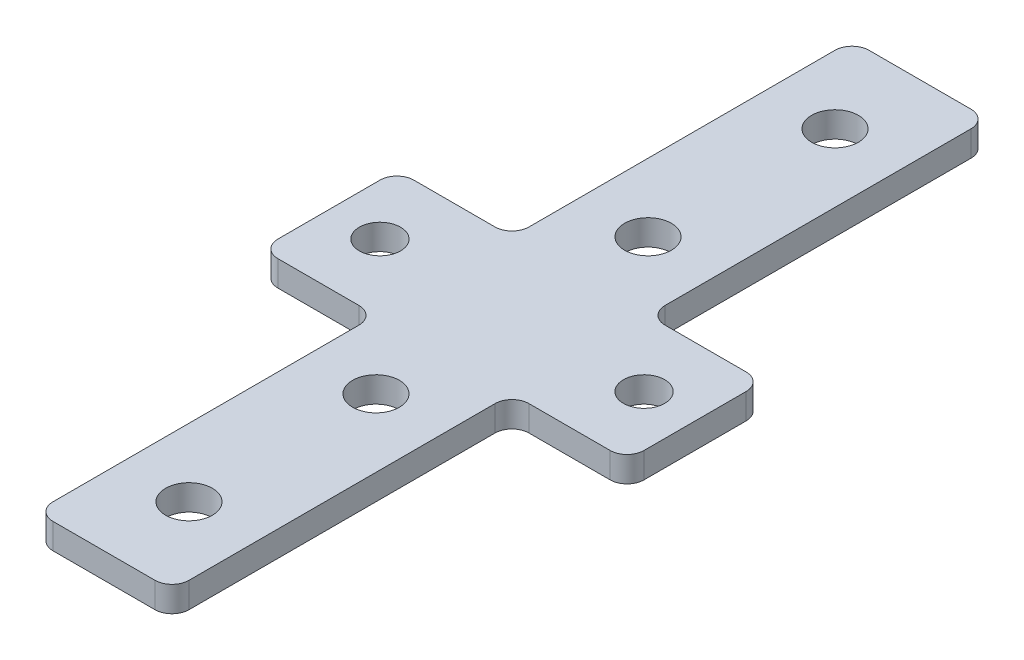
ISO-10303-21;
HEADER;
FILE_DESCRIPTION(('STEP AP214'),'2;1');
FILE_NAME('part.step','',(''),(''),'','','');
FILE_SCHEMA(('AUTOMOTIVE_DESIGN { 1 0 10303 214 1 1 1 1 }'));
ENDSEC;
DATA;
#1=APPLICATION_CONTEXT('core data for automotive mechanical design processes');
#2=APPLICATION_PROTOCOL_DEFINITION('international standard','automotive_design',2000,#1);
#3=PRODUCT_CONTEXT('',#1,'mechanical');
#4=PRODUCT('Part','Part','',(#3));
#5=PRODUCT_RELATED_PRODUCT_CATEGORY('part','',(#4));
#6=PRODUCT_DEFINITION_FORMATION('','',#4);
#7=PRODUCT_DEFINITION_CONTEXT('part definition',#1,'design');
#8=PRODUCT_DEFINITION('design','',#6,#7);
#9=PRODUCT_DEFINITION_SHAPE('','',#8);
#10=(LENGTH_UNIT() NAMED_UNIT(*) SI_UNIT(.MILLI.,.METRE.));
#11=(NAMED_UNIT(*) PLANE_ANGLE_UNIT() SI_UNIT($,.RADIAN.));
#12=(NAMED_UNIT(*) SI_UNIT($,.STERADIAN.) SOLID_ANGLE_UNIT());
#13=UNCERTAINTY_MEASURE_WITH_UNIT(LENGTH_MEASURE(1.E-05),#10,'distance_accuracy_value','');
#14=(GEOMETRIC_REPRESENTATION_CONTEXT(3) GLOBAL_UNCERTAINTY_ASSIGNED_CONTEXT((#13)) GLOBAL_UNIT_ASSIGNED_CONTEXT((#10,
#11,#12)) REPRESENTATION_CONTEXT('',''));
#15=CARTESIAN_POINT('',(0.,0.,0.));
#16=DIRECTION('',(0.,0.,1.));
#17=DIRECTION('',(1.,0.,0.));
#18=AXIS2_PLACEMENT_3D('',#15,#16,#17);
#19=CARTESIAN_POINT('',(9.99999999999999,3.,10.));
#20=DIRECTION('',(0.,1.,0.));
#21=DIRECTION('',(0.,0.,1.));
#22=AXIS2_PLACEMENT_3D('',#19,#20,#21);
#23=PLANE('',#22);
#24=CARTESIAN_POINT('',(-15.5382522235255,3.,0.));
#25=DIRECTION('',(0.,1.,0.));
#26=DIRECTION('',(0.,0.,1.));
#27=AXIS2_PLACEMENT_3D('',#24,#25,#26);
#28=CIRCLE('',#27,2.42331624847517);
#29=CARTESIAN_POINT('',(-15.5382522235255,3.,2.42331624847519));
#30=VERTEX_POINT('',#29);
#31=EDGE_CURVE('E538',#30,#30,#28,.T.);
#32=ORIENTED_EDGE('',*,*,#31,.F.);
#33=EDGE_LOOP('',(#32));
#34=FACE_BOUND('',#33,.T.);
#35=CARTESIAN_POINT('',(0.,3.,16.));
#36=DIRECTION('',(0.,1.,0.));
#37=DIRECTION('',(0.,0.,-1.));
#38=AXIS2_PLACEMENT_3D('',#35,#36,#37);
#39=CIRCLE('',#38,2.75);
#40=CARTESIAN_POINT('',(0.,3.,13.25));
#41=VERTEX_POINT('',#40);
#42=EDGE_CURVE('E554',#41,#41,#39,.T.);
#43=ORIENTED_EDGE('',*,*,#42,.F.);
#44=EDGE_LOOP('',(#43));
#45=FACE_BOUND('',#44,.T.);
#46=CARTESIAN_POINT('',(0.,3.,-38.));
#47=DIRECTION('',(0.,1.,0.));
#48=DIRECTION('',(0.,0.,1.));
#49=AXIS2_PLACEMENT_3D('',#46,#47,#48);
#50=CIRCLE('',#49,2.75);
#51=CARTESIAN_POINT('',(0.,3.,-35.25));
#52=VERTEX_POINT('',#51);
#53=EDGE_CURVE('E248',#52,#52,#50,.T.);
#54=ORIENTED_EDGE('',*,*,#53,.F.);
#55=EDGE_LOOP('',(#54));
#56=FACE_BOUND('',#55,.T.);
#57=CARTESIAN_POINT('',(9.99999999999999,3.,10.));
#58=DIRECTION('',(0.,-1.,0.));
#59=DIRECTION('',(0.,0.,1.));
#60=AXIS2_PLACEMENT_3D('',#57,#58,#59);
#61=CIRCLE('',#60,2.);
#62=CARTESIAN_POINT('',(7.99999999999999,3.,10.));
#63=VERTEX_POINT('',#62);
#64=CARTESIAN_POINT('',(10.,3.,8.00000000000002));
#65=VERTEX_POINT('',#64);
#66=EDGE_CURVE('E314',#63,#65,#61,.T.);
#67=ORIENTED_EDGE('',*,*,#66,.T.);
#68=DIRECTION('',(1.,0.,0.));
#69=VECTOR('',#68,1.);
#70=CARTESIAN_POINT('',(10.,3.,8.00000000000002));
#71=LINE('',#70,#69);
#72=CARTESIAN_POINT('',(19.5382522235255,3.,8.00000000000002));
#73=VERTEX_POINT('',#72);
#74=EDGE_CURVE('E154',#65,#73,#71,.T.);
#75=ORIENTED_EDGE('',*,*,#74,.T.);
#76=CARTESIAN_POINT('',(19.5382522235255,3.,6.00000000000002));
#77=DIRECTION('',(0.,1.,0.));
#78=DIRECTION('',(0.,0.,1.));
#79=AXIS2_PLACEMENT_3D('',#76,#77,#78);
#80=CIRCLE('',#79,2.);
#81=CARTESIAN_POINT('',(21.5382522235255,3.,6.00000000000001));
#82=VERTEX_POINT('',#81);
#83=EDGE_CURVE('E399',#73,#82,#80,.T.);
#84=ORIENTED_EDGE('',*,*,#83,.T.);
#85=DIRECTION('',(0.,0.,-1.));
#86=VECTOR('',#85,1.);
#87=CARTESIAN_POINT('',(21.5382522235255,3.,6.00000000000001));
#88=LINE('',#87,#86);
#89=CARTESIAN_POINT('',(21.5382522235255,3.,-5.99999999999997));
#90=VERTEX_POINT('',#89);
#91=EDGE_CURVE('E419',#82,#90,#88,.T.);
#92=ORIENTED_EDGE('',*,*,#91,.T.);
#93=CARTESIAN_POINT('',(19.5382522235255,3.,-5.99999999999998));
#94=DIRECTION('',(0.,1.,0.));
#95=DIRECTION('',(0.,0.,1.));
#96=AXIS2_PLACEMENT_3D('',#93,#94,#95);
#97=CIRCLE('',#96,2.);
#98=CARTESIAN_POINT('',(19.5382522235255,3.,-7.99999999999998));
#99=VERTEX_POINT('',#98);
#100=EDGE_CURVE('E415',#90,#99,#97,.T.);
#101=ORIENTED_EDGE('',*,*,#100,.T.);
#102=DIRECTION('',(-1.,0.,0.));
#103=VECTOR('',#102,1.);
#104=CARTESIAN_POINT('',(19.5382522235255,3.,-7.99999999999998));
#105=LINE('',#104,#103);
#106=CARTESIAN_POINT('',(10.,3.,-7.99999999999998));
#107=VERTEX_POINT('',#106);
#108=EDGE_CURVE('E418',#99,#107,#105,.T.);
#109=ORIENTED_EDGE('',*,*,#108,.T.);
#110=CARTESIAN_POINT('',(9.99999999999999,3.,-9.99999999999998));
#111=DIRECTION('',(0.,-1.,0.));
#112=DIRECTION('',(0.,0.,-1.));
#113=AXIS2_PLACEMENT_3D('',#110,#111,#112);
#114=CIRCLE('',#113,2.);
#115=CARTESIAN_POINT('',(7.99999999999999,3.,-9.99999999999999));
#116=VERTEX_POINT('',#115);
#117=EDGE_CURVE('E423',#107,#116,#114,.T.);
#118=ORIENTED_EDGE('',*,*,#117,.T.);
#119=DIRECTION('',(0.,0.,-1.));
#120=VECTOR('',#119,1.);
#121=CARTESIAN_POINT('',(7.99999999999999,3.,-46.));
#122=LINE('',#121,#120);
#123=CARTESIAN_POINT('',(7.99999999999999,3.,-46.));
#124=VERTEX_POINT('',#123);
#125=EDGE_CURVE('E430',#116,#124,#122,.T.);
#126=ORIENTED_EDGE('',*,*,#125,.T.);
#127=CARTESIAN_POINT('',(5.99999999999999,3.,-46.0000000000001));
#128=DIRECTION('',(0.,1.,0.));
#129=DIRECTION('',(0.,0.,-1.));
#130=AXIS2_PLACEMENT_3D('',#127,#128,#129);
#131=CIRCLE('',#130,2.);
#132=CARTESIAN_POINT('',(5.99999999999998,3.,-48.0000000000001));
#133=VERTEX_POINT('',#132);
#134=EDGE_CURVE('E433',#124,#133,#131,.T.);
#135=ORIENTED_EDGE('',*,*,#134,.T.);
#136=DIRECTION('',(-1.,0.,0.));
#137=VECTOR('',#136,1.);
#138=CARTESIAN_POINT('',(-6.00000000000001,3.,-48.0000000000001));
#139=LINE('',#138,#137);
#140=CARTESIAN_POINT('',(-6.00000000000001,3.,-48.0000000000001));
#141=VERTEX_POINT('',#140);
#142=EDGE_CURVE('E436',#133,#141,#139,.T.);
#143=ORIENTED_EDGE('',*,*,#142,.T.);
#144=CARTESIAN_POINT('',(-6.00000000000002,3.,-46.0000000000001));
#145=DIRECTION('',(0.,1.,0.));
#146=DIRECTION('',(0.,0.,-1.));
#147=AXIS2_PLACEMENT_3D('',#144,#145,#146);
#148=CIRCLE('',#147,2.);
#149=CARTESIAN_POINT('',(-8.00000000000002,3.,-46.));
#150=VERTEX_POINT('',#149);
#151=EDGE_CURVE('E439',#141,#150,#148,.T.);
#152=ORIENTED_EDGE('',*,*,#151,.T.);
#153=DIRECTION('',(0.,0.,1.));
#154=VECTOR('',#153,1.);
#155=CARTESIAN_POINT('',(-8.00000000000002,3.,-46.));
#156=LINE('',#155,#154);
#157=CARTESIAN_POINT('',(-8.00000000000002,3.,-9.99999999999999));
#158=VERTEX_POINT('',#157);
#159=EDGE_CURVE('E442',#150,#158,#156,.T.);
#160=ORIENTED_EDGE('',*,*,#159,.T.);
#161=CARTESIAN_POINT('',(-10.,3.,-9.99999999999998));
#162=DIRECTION('',(0.,-1.,0.));
#163=DIRECTION('',(0.,0.,-1.));
#164=AXIS2_PLACEMENT_3D('',#161,#162,#163);
#165=CIRCLE('',#164,2.);
#166=CARTESIAN_POINT('',(-10.,3.,-7.99999999999998));
#167=VERTEX_POINT('',#166);
#168=EDGE_CURVE('E445',#158,#167,#165,.T.);
#169=ORIENTED_EDGE('',*,*,#168,.T.);
#170=DIRECTION('',(-1.,0.,0.));
#171=VECTOR('',#170,1.);
#172=CARTESIAN_POINT('',(-19.5382522235255,3.,-7.99999999999998));
#173=LINE('',#172,#171);
#174=CARTESIAN_POINT('',(-19.5382522235255,3.,-7.99999999999998));
#175=VERTEX_POINT('',#174);
#176=EDGE_CURVE('E448',#167,#175,#173,.T.);
#177=ORIENTED_EDGE('',*,*,#176,.T.);
#178=CARTESIAN_POINT('',(-19.5382522235255,3.,-5.99999999999998));
#179=DIRECTION('',(0.,1.,0.));
#180=DIRECTION('',(0.,0.,-1.));
#181=AXIS2_PLACEMENT_3D('',#178,#179,#180);
#182=CIRCLE('',#181,2.);
#183=CARTESIAN_POINT('',(-21.5382522235255,3.,-5.99999999999996));
#184=VERTEX_POINT('',#183);
#185=EDGE_CURVE('E451',#175,#184,#182,.T.);
#186=ORIENTED_EDGE('',*,*,#185,.T.);
#187=DIRECTION('',(0.,0.,1.));
#188=VECTOR('',#187,1.);
#189=CARTESIAN_POINT('',(-21.5382522235255,3.,6.00000000000001));
#190=LINE('',#189,#188);
#191=CARTESIAN_POINT('',(-21.5382522235255,3.,6.00000000000001));
#192=VERTEX_POINT('',#191);
#193=EDGE_CURVE('E454',#184,#192,#190,.T.);
#194=ORIENTED_EDGE('',*,*,#193,.T.);
#195=CARTESIAN_POINT('',(-19.5382522235255,3.,6.00000000000002));
#196=DIRECTION('',(0.,1.,0.));
#197=DIRECTION('',(0.,0.,-1.));
#198=AXIS2_PLACEMENT_3D('',#195,#196,#197);
#199=CIRCLE('',#198,2.);
#200=CARTESIAN_POINT('',(-19.5382522235255,3.,8.00000000000002));
#201=VERTEX_POINT('',#200);
#202=EDGE_CURVE('E457',#192,#201,#199,.T.);
#203=ORIENTED_EDGE('',*,*,#202,.T.);
#204=DIRECTION('',(1.,0.,0.));
#205=VECTOR('',#204,1.);
#206=CARTESIAN_POINT('',(-19.5382522235255,3.,8.00000000000002));
#207=LINE('',#206,#205);
#208=CARTESIAN_POINT('',(-10.,3.,8.00000000000002));
#209=VERTEX_POINT('',#208);
#210=EDGE_CURVE('E460',#201,#209,#207,.T.);
#211=ORIENTED_EDGE('',*,*,#210,.T.);
#212=CARTESIAN_POINT('',(-10.,3.,10.));
#213=DIRECTION('',(0.,-1.,0.));
#214=DIRECTION('',(0.,0.,1.));
#215=AXIS2_PLACEMENT_3D('',#212,#213,#214);
#216=CIRCLE('',#215,2.);
#217=CARTESIAN_POINT('',(-8.00000000000002,3.,10.));
#218=VERTEX_POINT('',#217);
#219=EDGE_CURVE('E463',#209,#218,#216,.T.);
#220=ORIENTED_EDGE('',*,*,#219,.T.);
#221=DIRECTION('',(0.,0.,1.));
#222=VECTOR('',#221,1.);
#223=CARTESIAN_POINT('',(-8.00000000000002,3.,45.9999999999999));
#224=LINE('',#223,#222);
#225=CARTESIAN_POINT('',(-8.00000000000002,3.,45.9999999999999));
#226=VERTEX_POINT('',#225);
#227=EDGE_CURVE('E466',#218,#226,#224,.T.);
#228=ORIENTED_EDGE('',*,*,#227,.T.);
#229=CARTESIAN_POINT('',(-6.00000000000002,3.,45.9999999999999));
#230=DIRECTION('',(0.,1.,0.));
#231=DIRECTION('',(0.,0.,-1.));
#232=AXIS2_PLACEMENT_3D('',#229,#230,#231);
#233=CIRCLE('',#232,2.);
#234=CARTESIAN_POINT('',(-6.00000000000001,3.,47.9999999999999));
#235=VERTEX_POINT('',#234);
#236=EDGE_CURVE('E221',#226,#235,#233,.T.);
#237=ORIENTED_EDGE('',*,*,#236,.T.);
#238=DIRECTION('',(1.,0.,0.));
#239=VECTOR('',#238,1.);
#240=CARTESIAN_POINT('',(-6.00000000000001,3.,47.9999999999999));
#241=LINE('',#240,#239);
#242=CARTESIAN_POINT('',(5.99999999999998,3.,47.9999999999999));
#243=VERTEX_POINT('',#242);
#244=EDGE_CURVE('E215',#235,#243,#241,.T.);
#245=ORIENTED_EDGE('',*,*,#244,.T.);
#246=CARTESIAN_POINT('',(5.99999999999999,3.,45.9999999999999));
#247=DIRECTION('',(0.,1.,0.));
#248=DIRECTION('',(0.,0.,1.));
#249=AXIS2_PLACEMENT_3D('',#246,#247,#248);
#250=CIRCLE('',#249,2.);
#251=CARTESIAN_POINT('',(7.99999999999999,3.,45.9999999999999));
#252=VERTEX_POINT('',#251);
#253=EDGE_CURVE('E219',#243,#252,#250,.T.);
#254=ORIENTED_EDGE('',*,*,#253,.T.);
#255=DIRECTION('',(0.,0.,-1.));
#256=VECTOR('',#255,1.);
#257=CARTESIAN_POINT('',(7.99999999999999,3.,45.9999999999999));
#258=LINE('',#257,#256);
#259=EDGE_CURVE('E63',#252,#63,#258,.T.);
#260=ORIENTED_EDGE('',*,*,#259,.T.);
#261=EDGE_LOOP('',(#67,#75,#84,#92,#101,#109,#118,#126,#135,#143,#152,#160,#169,#177,#186,#194,
#203,#211,#220,#228,#237,#245,#254,#260));
#262=FACE_BOUND('',#261,.T.);
#263=CARTESIAN_POINT('',(0.,3.,-16.));
#264=DIRECTION('',(0.,1.,0.));
#265=DIRECTION('',(0.,0.,1.));
#266=AXIS2_PLACEMENT_3D('',#263,#264,#265);
#267=CIRCLE('',#266,2.75);
#268=CARTESIAN_POINT('',(0.,3.,-13.25));
#269=VERTEX_POINT('',#268);
#270=EDGE_CURVE('E562',#269,#269,#267,.T.);
#271=ORIENTED_EDGE('',*,*,#270,.F.);
#272=EDGE_LOOP('',(#271));
#273=FACE_BOUND('',#272,.T.);
#274=CARTESIAN_POINT('',(0.,3.,38.));
#275=DIRECTION('',(0.,1.,0.));
#276=DIRECTION('',(0.,0.,-1.));
#277=AXIS2_PLACEMENT_3D('',#274,#275,#276);
#278=CIRCLE('',#277,2.75);
#279=CARTESIAN_POINT('',(0.,3.,35.25));
#280=VERTEX_POINT('',#279);
#281=EDGE_CURVE('E546',#280,#280,#278,.T.);
#282=ORIENTED_EDGE('',*,*,#281,.F.);
#283=EDGE_LOOP('',(#282));
#284=FACE_BOUND('',#283,.T.);
#285=CARTESIAN_POINT('',(15.5382522235255,3.,0.));
#286=DIRECTION('',(0.,1.,0.));
#287=DIRECTION('',(0.,0.,-1.));
#288=AXIS2_PLACEMENT_3D('',#285,#286,#287);
#289=CIRCLE('',#288,2.42331624847518);
#290=CARTESIAN_POINT('',(15.5382522235255,3.,-2.42331624847516));
#291=VERTEX_POINT('',#290);
#292=EDGE_CURVE('E527',#291,#291,#289,.T.);
#293=ORIENTED_EDGE('',*,*,#292,.F.);
#294=EDGE_LOOP('',(#293));
#295=FACE_BOUND('',#294,.T.);
#296=ADVANCED_FACE('F45',(#34,#45,#56,#262,#273,#284,#295),#23,.T.);
#297=CARTESIAN_POINT('',(9.99999999999999,0.,10.));
#298=DIRECTION('',(0.,1.,0.));
#299=DIRECTION('',(0.,0.,1.));
#300=AXIS2_PLACEMENT_3D('',#297,#298,#299);
#301=PLANE('',#300);
#302=CARTESIAN_POINT('',(9.99999999999999,0.,10.));
#303=DIRECTION('',(0.,-1.,0.));
#304=DIRECTION('',(0.,0.,1.));
#305=AXIS2_PLACEMENT_3D('',#302,#303,#304);
#306=CIRCLE('',#305,2.);
#307=CARTESIAN_POINT('',(7.99999999999999,0.,10.));
#308=VERTEX_POINT('',#307);
#309=CARTESIAN_POINT('',(10.,0.,8.00000000000002));
#310=VERTEX_POINT('',#309);
#311=EDGE_CURVE('E243',#308,#310,#306,.T.);
#312=ORIENTED_EDGE('',*,*,#311,.F.);
#313=DIRECTION('',(0.,0.,-1.));
#314=VECTOR('',#313,1.);
#315=CARTESIAN_POINT('',(7.99999999999999,0.,45.9999999999999));
#316=LINE('',#315,#314);
#317=CARTESIAN_POINT('',(7.99999999999999,0.,45.9999999999999));
#318=VERTEX_POINT('',#317);
#319=EDGE_CURVE('E146',#318,#308,#316,.T.);
#320=ORIENTED_EDGE('',*,*,#319,.F.);
#321=CARTESIAN_POINT('',(5.99999999999999,0.,45.9999999999999));
#322=DIRECTION('',(0.,1.,0.));
#323=DIRECTION('',(0.,0.,1.));
#324=AXIS2_PLACEMENT_3D('',#321,#322,#323);
#325=CIRCLE('',#324,2.);
#326=CARTESIAN_POINT('',(5.99999999999998,0.,47.9999999999999));
#327=VERTEX_POINT('',#326);
#328=EDGE_CURVE('E140',#327,#318,#325,.T.);
#329=ORIENTED_EDGE('',*,*,#328,.F.);
#330=DIRECTION('',(1.,0.,0.));
#331=VECTOR('',#330,1.);
#332=CARTESIAN_POINT('',(-6.00000000000001,0.,47.9999999999999));
#333=LINE('',#332,#331);
#334=CARTESIAN_POINT('',(-6.00000000000001,0.,47.9999999999999));
#335=VERTEX_POINT('',#334);
#336=EDGE_CURVE('E230',#335,#327,#333,.T.);
#337=ORIENTED_EDGE('',*,*,#336,.F.);
#338=CARTESIAN_POINT('',(-6.00000000000002,0.,45.9999999999999));
#339=DIRECTION('',(0.,1.,0.));
#340=DIRECTION('',(0.,0.,-1.));
#341=AXIS2_PLACEMENT_3D('',#338,#339,#340);
#342=CIRCLE('',#341,2.);
#343=CARTESIAN_POINT('',(-8.00000000000002,0.,45.9999999999999));
#344=VERTEX_POINT('',#343);
#345=EDGE_CURVE('E305',#344,#335,#342,.T.);
#346=ORIENTED_EDGE('',*,*,#345,.F.);
#347=DIRECTION('',(0.,0.,1.));
#348=VECTOR('',#347,1.);
#349=CARTESIAN_POINT('',(-8.00000000000002,0.,45.9999999999999));
#350=LINE('',#349,#348);
#351=CARTESIAN_POINT('',(-8.00000000000002,0.,10.));
#352=VERTEX_POINT('',#351);
#353=EDGE_CURVE('E302',#352,#344,#350,.T.);
#354=ORIENTED_EDGE('',*,*,#353,.F.);
#355=CARTESIAN_POINT('',(-10.,0.,10.));
#356=DIRECTION('',(0.,-1.,0.));
#357=DIRECTION('',(0.,0.,1.));
#358=AXIS2_PLACEMENT_3D('',#355,#356,#357);
#359=CIRCLE('',#358,2.);
#360=CARTESIAN_POINT('',(-10.,0.,8.00000000000002));
#361=VERTEX_POINT('',#360);
#362=EDGE_CURVE('E299',#361,#352,#359,.T.);
#363=ORIENTED_EDGE('',*,*,#362,.F.);
#364=DIRECTION('',(1.,0.,0.));
#365=VECTOR('',#364,1.);
#366=CARTESIAN_POINT('',(-19.5382522235255,0.,8.00000000000002));
#367=LINE('',#366,#365);
#368=CARTESIAN_POINT('',(-19.5382522235255,0.,8.00000000000002));
#369=VERTEX_POINT('',#368);
#370=EDGE_CURVE('E296',#369,#361,#367,.T.);
#371=ORIENTED_EDGE('',*,*,#370,.F.);
#372=CARTESIAN_POINT('',(-19.5382522235255,0.,6.00000000000002));
#373=DIRECTION('',(0.,1.,0.));
#374=DIRECTION('',(0.,0.,-1.));
#375=AXIS2_PLACEMENT_3D('',#372,#373,#374);
#376=CIRCLE('',#375,2.);
#377=CARTESIAN_POINT('',(-21.5382522235255,0.,6.00000000000001));
#378=VERTEX_POINT('',#377);
#379=EDGE_CURVE('E293',#378,#369,#376,.T.);
#380=ORIENTED_EDGE('',*,*,#379,.F.);
#381=DIRECTION('',(0.,0.,1.));
#382=VECTOR('',#381,1.);
#383=CARTESIAN_POINT('',(-21.5382522235255,0.,6.00000000000001));
#384=LINE('',#383,#382);
#385=CARTESIAN_POINT('',(-21.5382522235255,0.,-5.99999999999996));
#386=VERTEX_POINT('',#385);
#387=EDGE_CURVE('E290',#386,#378,#384,.T.);
#388=ORIENTED_EDGE('',*,*,#387,.F.);
#389=CARTESIAN_POINT('',(-19.5382522235255,0.,-5.99999999999998));
#390=DIRECTION('',(0.,1.,0.));
#391=DIRECTION('',(0.,0.,-1.));
#392=AXIS2_PLACEMENT_3D('',#389,#390,#391);
#393=CIRCLE('',#392,2.);
#394=CARTESIAN_POINT('',(-19.5382522235255,0.,-7.99999999999998));
#395=VERTEX_POINT('',#394);
#396=EDGE_CURVE('E287',#395,#386,#393,.T.);
#397=ORIENTED_EDGE('',*,*,#396,.F.);
#398=DIRECTION('',(-1.,0.,0.));
#399=VECTOR('',#398,1.);
#400=CARTESIAN_POINT('',(-19.5382522235255,0.,-7.99999999999998));
#401=LINE('',#400,#399);
#402=CARTESIAN_POINT('',(-10.,0.,-7.99999999999998));
#403=VERTEX_POINT('',#402);
#404=EDGE_CURVE('E284',#403,#395,#401,.T.);
#405=ORIENTED_EDGE('',*,*,#404,.F.);
#406=CARTESIAN_POINT('',(-10.,0.,-9.99999999999998));
#407=DIRECTION('',(0.,-1.,0.));
#408=DIRECTION('',(0.,0.,-1.));
#409=AXIS2_PLACEMENT_3D('',#406,#407,#408);
#410=CIRCLE('',#409,2.);
#411=CARTESIAN_POINT('',(-8.00000000000002,0.,-9.99999999999999));
#412=VERTEX_POINT('',#411);
#413=EDGE_CURVE('E281',#412,#403,#410,.T.);
#414=ORIENTED_EDGE('',*,*,#413,.F.);
#415=DIRECTION('',(0.,0.,1.));
#416=VECTOR('',#415,1.);
#417=CARTESIAN_POINT('',(-8.00000000000002,0.,-46.));
#418=LINE('',#417,#416);
#419=CARTESIAN_POINT('',(-8.00000000000002,0.,-46.));
#420=VERTEX_POINT('',#419);
#421=EDGE_CURVE('E278',#420,#412,#418,.T.);
#422=ORIENTED_EDGE('',*,*,#421,.F.);
#423=CARTESIAN_POINT('',(-6.00000000000002,0.,-46.0000000000001));
#424=DIRECTION('',(0.,1.,0.));
#425=DIRECTION('',(0.,0.,-1.));
#426=AXIS2_PLACEMENT_3D('',#423,#424,#425);
#427=CIRCLE('',#426,2.);
#428=CARTESIAN_POINT('',(-6.00000000000001,0.,-48.0000000000001));
#429=VERTEX_POINT('',#428);
#430=EDGE_CURVE('E275',#429,#420,#427,.T.);
#431=ORIENTED_EDGE('',*,*,#430,.F.);
#432=DIRECTION('',(-1.,0.,0.));
#433=VECTOR('',#432,1.);
#434=CARTESIAN_POINT('',(-6.00000000000001,0.,-48.0000000000001));
#435=LINE('',#434,#433);
#436=CARTESIAN_POINT('',(5.99999999999998,0.,-48.0000000000001));
#437=VERTEX_POINT('',#436);
#438=EDGE_CURVE('E272',#437,#429,#435,.T.);
#439=ORIENTED_EDGE('',*,*,#438,.F.);
#440=CARTESIAN_POINT('',(5.99999999999999,0.,-46.0000000000001));
#441=DIRECTION('',(0.,1.,0.));
#442=DIRECTION('',(0.,0.,-1.));
#443=AXIS2_PLACEMENT_3D('',#440,#441,#442);
#444=CIRCLE('',#443,2.);
#445=CARTESIAN_POINT('',(7.99999999999999,0.,-46.));
#446=VERTEX_POINT('',#445);
#447=EDGE_CURVE('E269',#446,#437,#444,.T.);
#448=ORIENTED_EDGE('',*,*,#447,.F.);
#449=DIRECTION('',(0.,0.,-1.));
#450=VECTOR('',#449,1.);
#451=CARTESIAN_POINT('',(7.99999999999999,0.,-46.));
#452=LINE('',#451,#450);
#453=CARTESIAN_POINT('',(7.99999999999999,0.,-9.99999999999999));
#454=VERTEX_POINT('',#453);
#455=EDGE_CURVE('E266',#454,#446,#452,.T.);
#456=ORIENTED_EDGE('',*,*,#455,.F.);
#457=CARTESIAN_POINT('',(9.99999999999999,0.,-9.99999999999998));
#458=DIRECTION('',(0.,-1.,0.));
#459=DIRECTION('',(0.,0.,-1.));
#460=AXIS2_PLACEMENT_3D('',#457,#458,#459);
#461=CIRCLE('',#460,2.);
#462=CARTESIAN_POINT('',(10.,0.,-7.99999999999998));
#463=VERTEX_POINT('',#462);
#464=EDGE_CURVE('E263',#463,#454,#461,.T.);
#465=ORIENTED_EDGE('',*,*,#464,.F.);
#466=DIRECTION('',(-1.,0.,0.));
#467=VECTOR('',#466,1.);
#468=CARTESIAN_POINT('',(19.5382522235255,0.,-7.99999999999998));
#469=LINE('',#468,#467);
#470=CARTESIAN_POINT('',(19.5382522235255,0.,-7.99999999999998));
#471=VERTEX_POINT('',#470);
#472=EDGE_CURVE('E260',#471,#463,#469,.T.);
#473=ORIENTED_EDGE('',*,*,#472,.F.);
#474=CARTESIAN_POINT('',(19.5382522235255,0.,-5.99999999999998));
#475=DIRECTION('',(0.,1.,0.));
#476=DIRECTION('',(0.,0.,1.));
#477=AXIS2_PLACEMENT_3D('',#474,#475,#476);
#478=CIRCLE('',#477,2.);
#479=CARTESIAN_POINT('',(21.5382522235255,0.,-5.99999999999997));
#480=VERTEX_POINT('',#479);
#481=EDGE_CURVE('E257',#480,#471,#478,.T.);
#482=ORIENTED_EDGE('',*,*,#481,.F.);
#483=DIRECTION('',(0.,0.,-1.));
#484=VECTOR('',#483,1.);
#485=CARTESIAN_POINT('',(21.5382522235255,0.,6.00000000000001));
#486=LINE('',#485,#484);
#487=CARTESIAN_POINT('',(21.5382522235255,0.,6.00000000000001));
#488=VERTEX_POINT('',#487);
#489=EDGE_CURVE('E254',#488,#480,#486,.T.);
#490=ORIENTED_EDGE('',*,*,#489,.F.);
#491=CARTESIAN_POINT('',(19.5382522235255,0.,6.00000000000002));
#492=DIRECTION('',(0.,1.,0.));
#493=DIRECTION('',(0.,0.,1.));
#494=AXIS2_PLACEMENT_3D('',#491,#492,#493);
#495=CIRCLE('',#494,2.);
#496=CARTESIAN_POINT('',(19.5382522235255,0.,8.00000000000002));
#497=VERTEX_POINT('',#496);
#498=EDGE_CURVE('E251',#497,#488,#495,.T.);
#499=ORIENTED_EDGE('',*,*,#498,.F.);
#500=DIRECTION('',(1.,0.,0.));
#501=VECTOR('',#500,1.);
#502=CARTESIAN_POINT('',(10.,0.,8.00000000000002));
#503=LINE('',#502,#501);
#504=EDGE_CURVE('E247',#310,#497,#503,.T.);
#505=ORIENTED_EDGE('',*,*,#504,.F.);
#506=EDGE_LOOP('',(#312,#320,#329,#337,#346,#354,#363,#371,#380,#388,#397,#405,#414,#422,#431,
#439,#448,#456,#465,#473,#482,#490,#499,#505));
#507=FACE_BOUND('',#506,.T.);
#508=CARTESIAN_POINT('',(0.,0.,-38.));
#509=DIRECTION('',(0.,1.,0.));
#510=DIRECTION('',(0.,0.,1.));
#511=AXIS2_PLACEMENT_3D('',#508,#509,#510);
#512=CIRCLE('',#511,2.75);
#513=CARTESIAN_POINT('',(0.,0.,-35.25));
#514=VERTEX_POINT('',#513);
#515=EDGE_CURVE('E566',#514,#514,#512,.T.);
#516=ORIENTED_EDGE('',*,*,#515,.T.);
#517=EDGE_LOOP('',(#516));
#518=FACE_BOUND('',#517,.T.);
#519=CARTESIAN_POINT('',(0.,0.,-16.));
#520=DIRECTION('',(0.,1.,0.));
#521=DIRECTION('',(0.,0.,1.));
#522=AXIS2_PLACEMENT_3D('',#519,#520,#521);
#523=CIRCLE('',#522,2.75);
#524=CARTESIAN_POINT('',(0.,0.,-13.25));
#525=VERTEX_POINT('',#524);
#526=EDGE_CURVE('E558',#525,#525,#523,.T.);
#527=ORIENTED_EDGE('',*,*,#526,.T.);
#528=EDGE_LOOP('',(#527));
#529=FACE_BOUND('',#528,.T.);
#530=CARTESIAN_POINT('',(0.,0.,16.));
#531=DIRECTION('',(0.,1.,0.));
#532=DIRECTION('',(0.,0.,-1.));
#533=AXIS2_PLACEMENT_3D('',#530,#531,#532);
#534=CIRCLE('',#533,2.75);
#535=CARTESIAN_POINT('',(0.,0.,13.25));
#536=VERTEX_POINT('',#535);
#537=EDGE_CURVE('E550',#536,#536,#534,.T.);
#538=ORIENTED_EDGE('',*,*,#537,.T.);
#539=EDGE_LOOP('',(#538));
#540=FACE_BOUND('',#539,.T.);
#541=CARTESIAN_POINT('',(0.,0.,38.));
#542=DIRECTION('',(0.,1.,0.));
#543=DIRECTION('',(0.,0.,-1.));
#544=AXIS2_PLACEMENT_3D('',#541,#542,#543);
#545=CIRCLE('',#544,2.75);
#546=CARTESIAN_POINT('',(0.,0.,35.25));
#547=VERTEX_POINT('',#546);
#548=EDGE_CURVE('E542',#547,#547,#545,.T.);
#549=ORIENTED_EDGE('',*,*,#548,.T.);
#550=EDGE_LOOP('',(#549));
#551=FACE_BOUND('',#550,.T.);
#552=CARTESIAN_POINT('',(-15.5382522235255,0.,0.));
#553=DIRECTION('',(0.,1.,0.));
#554=DIRECTION('',(0.,0.,1.));
#555=AXIS2_PLACEMENT_3D('',#552,#553,#554);
#556=CIRCLE('',#555,2.42331624847517);
#557=CARTESIAN_POINT('',(-15.5382522235255,0.,2.42331624847519));
#558=VERTEX_POINT('',#557);
#559=EDGE_CURVE('E535',#558,#558,#556,.T.);
#560=ORIENTED_EDGE('',*,*,#559,.T.);
#561=EDGE_LOOP('',(#560));
#562=FACE_BOUND('',#561,.T.);
#563=CARTESIAN_POINT('',(15.5382522235255,0.,0.));
#564=DIRECTION('',(0.,1.,0.));
#565=DIRECTION('',(0.,0.,-1.));
#566=AXIS2_PLACEMENT_3D('',#563,#564,#565);
#567=CIRCLE('',#566,2.42331624847518);
#568=CARTESIAN_POINT('',(15.5382522235255,0.,-2.42331624847516));
#569=VERTEX_POINT('',#568);
#570=EDGE_CURVE('E530',#569,#569,#567,.T.);
#571=ORIENTED_EDGE('',*,*,#570,.T.);
#572=EDGE_LOOP('',(#571));
#573=FACE_BOUND('',#572,.T.);
#574=ADVANCED_FACE('F403',(#507,#518,#529,#540,#551,#562,#573),#301,.F.);
#575=CARTESIAN_POINT('',(9.99999999999999,3.,10.));
#576=DIRECTION('',(0.,-1.,0.));
#577=DIRECTION('',(0.,0.,-1.));
#578=AXIS2_PLACEMENT_3D('',#575,#576,#577);
#579=CYLINDRICAL_SURFACE('',#578,2.);
#580=ORIENTED_EDGE('',*,*,#311,.T.);
#581=DIRECTION('',(0.,-1.,0.));
#582=VECTOR('',#581,1.);
#583=CARTESIAN_POINT('',(10.,3.,8.00000000000002));
#584=LINE('',#583,#582);
#585=EDGE_CURVE('E11',#65,#310,#584,.T.);
#586=ORIENTED_EDGE('',*,*,#585,.F.);
#587=ORIENTED_EDGE('',*,*,#66,.F.);
#588=DIRECTION('',(0.,-1.,0.));
#589=VECTOR('',#588,1.);
#590=CARTESIAN_POINT('',(7.99999999999999,3.,10.));
#591=LINE('',#590,#589);
#592=EDGE_CURVE('E239',#63,#308,#591,.T.);
#593=ORIENTED_EDGE('',*,*,#592,.T.);
#594=EDGE_LOOP('',(#580,#586,#587,#593));
#595=FACE_BOUND('',#594,.T.);
#596=ADVANCED_FACE('F47',(#595),#579,.F.);
#597=CARTESIAN_POINT('',(10.,3.,8.00000000000002));
#598=DIRECTION('',(0.,0.,-1.));
#599=DIRECTION('',(-1.,0.,0.));
#600=AXIS2_PLACEMENT_3D('',#597,#598,#599);
#601=PLANE('',#600);
#602=ORIENTED_EDGE('',*,*,#504,.T.);
#603=DIRECTION('',(0.,-1.,0.));
#604=VECTOR('',#603,1.);
#605=CARTESIAN_POINT('',(19.5382522235255,3.,8.00000000000002));
#606=LINE('',#605,#604);
#607=EDGE_CURVE('E55',#73,#497,#606,.T.);
#608=ORIENTED_EDGE('',*,*,#607,.F.);
#609=ORIENTED_EDGE('',*,*,#74,.F.);
#610=ORIENTED_EDGE('',*,*,#585,.T.);
#611=EDGE_LOOP('',(#602,#608,#609,#610));
#612=FACE_BOUND('',#611,.T.);
#613=ADVANCED_FACE('F826',(#612),#601,.F.);
#614=CARTESIAN_POINT('',(19.5382522235255,3.,6.00000000000002));
#615=DIRECTION('',(0.,-1.,0.));
#616=DIRECTION('',(0.,0.,-1.));
#617=AXIS2_PLACEMENT_3D('',#614,#615,#616);
#618=CYLINDRICAL_SURFACE('',#617,2.);
#619=ORIENTED_EDGE('',*,*,#498,.T.);
#620=DIRECTION('',(0.,-1.,0.));
#621=VECTOR('',#620,1.);
#622=CARTESIAN_POINT('',(21.5382522235255,3.,6.00000000000001));
#623=LINE('',#622,#621);
#624=EDGE_CURVE('E389',#82,#488,#623,.T.);
#625=ORIENTED_EDGE('',*,*,#624,.F.);
#626=ORIENTED_EDGE('',*,*,#83,.F.);
#627=ORIENTED_EDGE('',*,*,#607,.T.);
#628=EDGE_LOOP('',(#619,#625,#626,#627));
#629=FACE_BOUND('',#628,.T.);
#630=ADVANCED_FACE('F397',(#629),#618,.T.);
#631=CARTESIAN_POINT('',(21.5382522235255,3.,6.00000000000001));
#632=DIRECTION('',(-1.,0.,0.));
#633=DIRECTION('',(0.,0.,1.));
#634=AXIS2_PLACEMENT_3D('',#631,#632,#633);
#635=PLANE('',#634);
#636=ORIENTED_EDGE('',*,*,#489,.T.);
#637=DIRECTION('',(0.,-1.,0.));
#638=VECTOR('',#637,1.);
#639=CARTESIAN_POINT('',(21.5382522235255,3.,-5.99999999999997));
#640=LINE('',#639,#638);
#641=EDGE_CURVE('E385',#90,#480,#640,.T.);
#642=ORIENTED_EDGE('',*,*,#641,.F.);
#643=ORIENTED_EDGE('',*,*,#91,.F.);
#644=ORIENTED_EDGE('',*,*,#624,.T.);
#645=EDGE_LOOP('',(#636,#642,#643,#644));
#646=FACE_BOUND('',#645,.T.);
#647=ADVANCED_FACE('F409',(#646),#635,.F.);
#648=CARTESIAN_POINT('',(19.5382522235255,3.,-5.99999999999998));
#649=DIRECTION('',(0.,-1.,0.));
#650=DIRECTION('',(0.,0.,-1.));
#651=AXIS2_PLACEMENT_3D('',#648,#649,#650);
#652=CYLINDRICAL_SURFACE('',#651,2.);
#653=ORIENTED_EDGE('',*,*,#481,.T.);
#654=DIRECTION('',(0.,-1.,0.));
#655=VECTOR('',#654,1.);
#656=CARTESIAN_POINT('',(19.5382522235255,3.,-7.99999999999998));
#657=LINE('',#656,#655);
#658=EDGE_CURVE('E381',#99,#471,#657,.T.);
#659=ORIENTED_EDGE('',*,*,#658,.F.);
#660=ORIENTED_EDGE('',*,*,#100,.F.);
#661=ORIENTED_EDGE('',*,*,#641,.T.);
#662=EDGE_LOOP('',(#653,#659,#660,#661));
#663=FACE_BOUND('',#662,.T.);
#664=ADVANCED_FACE('F413',(#663),#652,.T.);
#665=CARTESIAN_POINT('',(19.5382522235255,3.,-7.99999999999998));
#666=DIRECTION('',(0.,0.,1.));
#667=DIRECTION('',(1.,0.,0.));
#668=AXIS2_PLACEMENT_3D('',#665,#666,#667);
#669=PLANE('',#668);
#670=ORIENTED_EDGE('',*,*,#472,.T.);
#671=DIRECTION('',(0.,-1.,0.));
#672=VECTOR('',#671,1.);
#673=CARTESIAN_POINT('',(10.,3.,-7.99999999999998));
#674=LINE('',#673,#672);
#675=EDGE_CURVE('E377',#107,#463,#674,.T.);
#676=ORIENTED_EDGE('',*,*,#675,.F.);
#677=ORIENTED_EDGE('',*,*,#108,.F.);
#678=ORIENTED_EDGE('',*,*,#658,.T.);
#679=EDGE_LOOP('',(#670,#676,#677,#678));
#680=FACE_BOUND('',#679,.T.);
#681=ADVANCED_FACE('F791',(#680),#669,.F.);
#682=CARTESIAN_POINT('',(9.99999999999999,3.,-9.99999999999998));
#683=DIRECTION('',(0.,-1.,0.));
#684=DIRECTION('',(0.,0.,-1.));
#685=AXIS2_PLACEMENT_3D('',#682,#683,#684);
#686=CYLINDRICAL_SURFACE('',#685,2.);
#687=ORIENTED_EDGE('',*,*,#464,.T.);
#688=DIRECTION('',(0.,-1.,0.));
#689=VECTOR('',#688,1.);
#690=CARTESIAN_POINT('',(7.99999999999999,3.,-9.99999999999999));
#691=LINE('',#690,#689);
#692=EDGE_CURVE('E373',#116,#454,#691,.T.);
#693=ORIENTED_EDGE('',*,*,#692,.F.);
#694=ORIENTED_EDGE('',*,*,#117,.F.);
#695=ORIENTED_EDGE('',*,*,#675,.T.);
#696=EDGE_LOOP('',(#687,#693,#694,#695));
#697=FACE_BOUND('',#696,.T.);
#698=ADVANCED_FACE('F781',(#697),#686,.F.);
#699=CARTESIAN_POINT('',(7.99999999999999,3.,-46.));
#700=DIRECTION('',(-1.,0.,0.));
#701=DIRECTION('',(0.,0.,1.));
#702=AXIS2_PLACEMENT_3D('',#699,#700,#701);
#703=PLANE('',#702);
#704=ORIENTED_EDGE('',*,*,#455,.T.);
#705=DIRECTION('',(0.,-1.,0.));
#706=VECTOR('',#705,1.);
#707=CARTESIAN_POINT('',(7.99999999999999,3.,-46.));
#708=LINE('',#707,#706);
#709=EDGE_CURVE('E369',#124,#446,#708,.T.);
#710=ORIENTED_EDGE('',*,*,#709,.F.);
#711=ORIENTED_EDGE('',*,*,#125,.F.);
#712=ORIENTED_EDGE('',*,*,#692,.T.);
#713=EDGE_LOOP('',(#704,#710,#711,#712));
#714=FACE_BOUND('',#713,.T.);
#715=ADVANCED_FACE('F771',(#714),#703,.F.);
#716=CARTESIAN_POINT('',(5.99999999999999,3.,-46.0000000000001));
#717=DIRECTION('',(0.,-1.,0.));
#718=DIRECTION('',(0.,0.,-1.));
#719=AXIS2_PLACEMENT_3D('',#716,#717,#718);
#720=CYLINDRICAL_SURFACE('',#719,2.);
#721=ORIENTED_EDGE('',*,*,#447,.T.);
#722=DIRECTION('',(0.,-1.,0.));
#723=VECTOR('',#722,1.);
#724=CARTESIAN_POINT('',(5.99999999999998,3.,-48.0000000000001));
#725=LINE('',#724,#723);
#726=EDGE_CURVE('E365',#133,#437,#725,.T.);
#727=ORIENTED_EDGE('',*,*,#726,.F.);
#728=ORIENTED_EDGE('',*,*,#134,.F.);
#729=ORIENTED_EDGE('',*,*,#709,.T.);
#730=EDGE_LOOP('',(#721,#727,#728,#729));
#731=FACE_BOUND('',#730,.T.);
#732=ADVANCED_FACE('F761',(#731),#720,.T.);
#733=CARTESIAN_POINT('',(-6.00000000000001,3.,-48.0000000000001));
#734=DIRECTION('',(0.,0.,1.));
#735=DIRECTION('',(1.,0.,0.));
#736=AXIS2_PLACEMENT_3D('',#733,#734,#735);
#737=PLANE('',#736);
#738=ORIENTED_EDGE('',*,*,#438,.T.);
#739=DIRECTION('',(0.,-1.,0.));
#740=VECTOR('',#739,1.);
#741=CARTESIAN_POINT('',(-6.00000000000001,3.,-48.0000000000001));
#742=LINE('',#741,#740);
#743=EDGE_CURVE('E361',#141,#429,#742,.T.);
#744=ORIENTED_EDGE('',*,*,#743,.F.);
#745=ORIENTED_EDGE('',*,*,#142,.F.);
#746=ORIENTED_EDGE('',*,*,#726,.T.);
#747=EDGE_LOOP('',(#738,#744,#745,#746));
#748=FACE_BOUND('',#747,.T.);
#749=ADVANCED_FACE('F751',(#748),#737,.F.);
#750=CARTESIAN_POINT('',(-6.00000000000002,3.,-46.0000000000001));
#751=DIRECTION('',(0.,-1.,0.));
#752=DIRECTION('',(0.,0.,-1.));
#753=AXIS2_PLACEMENT_3D('',#750,#751,#752);
#754=CYLINDRICAL_SURFACE('',#753,2.);
#755=ORIENTED_EDGE('',*,*,#430,.T.);
#756=DIRECTION('',(0.,-1.,0.));
#757=VECTOR('',#756,1.);
#758=CARTESIAN_POINT('',(-8.00000000000002,3.,-46.));
#759=LINE('',#758,#757);
#760=EDGE_CURVE('E357',#150,#420,#759,.T.);
#761=ORIENTED_EDGE('',*,*,#760,.F.);
#762=ORIENTED_EDGE('',*,*,#151,.F.);
#763=ORIENTED_EDGE('',*,*,#743,.T.);
#764=EDGE_LOOP('',(#755,#761,#762,#763));
#765=FACE_BOUND('',#764,.T.);
#766=ADVANCED_FACE('F741',(#765),#754,.T.);
#767=CARTESIAN_POINT('',(-8.00000000000002,3.,-46.));
#768=DIRECTION('',(1.,0.,0.));
#769=DIRECTION('',(0.,0.,-1.));
#770=AXIS2_PLACEMENT_3D('',#767,#768,#769);
#771=PLANE('',#770);
#772=ORIENTED_EDGE('',*,*,#421,.T.);
#773=DIRECTION('',(0.,-1.,0.));
#774=VECTOR('',#773,1.);
#775=CARTESIAN_POINT('',(-8.00000000000002,3.,-9.99999999999999));
#776=LINE('',#775,#774);
#777=EDGE_CURVE('E353',#158,#412,#776,.T.);
#778=ORIENTED_EDGE('',*,*,#777,.F.);
#779=ORIENTED_EDGE('',*,*,#159,.F.);
#780=ORIENTED_EDGE('',*,*,#760,.T.);
#781=EDGE_LOOP('',(#772,#778,#779,#780));
#782=FACE_BOUND('',#781,.T.);
#783=ADVANCED_FACE('F731',(#782),#771,.F.);
#784=CARTESIAN_POINT('',(-10.,3.,-9.99999999999998));
#785=DIRECTION('',(0.,-1.,0.));
#786=DIRECTION('',(0.,0.,-1.));
#787=AXIS2_PLACEMENT_3D('',#784,#785,#786);
#788=CYLINDRICAL_SURFACE('',#787,2.);
#789=ORIENTED_EDGE('',*,*,#413,.T.);
#790=DIRECTION('',(0.,-1.,0.));
#791=VECTOR('',#790,1.);
#792=CARTESIAN_POINT('',(-10.,3.,-7.99999999999998));
#793=LINE('',#792,#791);
#794=EDGE_CURVE('E349',#167,#403,#793,.T.);
#795=ORIENTED_EDGE('',*,*,#794,.F.);
#796=ORIENTED_EDGE('',*,*,#168,.F.);
#797=ORIENTED_EDGE('',*,*,#777,.T.);
#798=EDGE_LOOP('',(#789,#795,#796,#797));
#799=FACE_BOUND('',#798,.T.);
#800=ADVANCED_FACE('F721',(#799),#788,.F.);
#801=CARTESIAN_POINT('',(-19.5382522235255,3.,-7.99999999999998));
#802=DIRECTION('',(0.,0.,1.));
#803=DIRECTION('',(1.,0.,0.));
#804=AXIS2_PLACEMENT_3D('',#801,#802,#803);
#805=PLANE('',#804);
#806=ORIENTED_EDGE('',*,*,#404,.T.);
#807=DIRECTION('',(0.,-1.,0.));
#808=VECTOR('',#807,1.);
#809=CARTESIAN_POINT('',(-19.5382522235255,3.,-7.99999999999998));
#810=LINE('',#809,#808);
#811=EDGE_CURVE('E345',#175,#395,#810,.T.);
#812=ORIENTED_EDGE('',*,*,#811,.F.);
#813=ORIENTED_EDGE('',*,*,#176,.F.);
#814=ORIENTED_EDGE('',*,*,#794,.T.);
#815=EDGE_LOOP('',(#806,#812,#813,#814));
#816=FACE_BOUND('',#815,.T.);
#817=ADVANCED_FACE('F711',(#816),#805,.F.);
#818=CARTESIAN_POINT('',(-19.5382522235255,3.,-5.99999999999998));
#819=DIRECTION('',(0.,-1.,0.));
#820=DIRECTION('',(0.,0.,-1.));
#821=AXIS2_PLACEMENT_3D('',#818,#819,#820);
#822=CYLINDRICAL_SURFACE('',#821,2.);
#823=ORIENTED_EDGE('',*,*,#396,.T.);
#824=DIRECTION('',(0.,-1.,0.));
#825=VECTOR('',#824,1.);
#826=CARTESIAN_POINT('',(-21.5382522235255,3.,-5.99999999999996));
#827=LINE('',#826,#825);
#828=EDGE_CURVE('E341',#184,#386,#827,.T.);
#829=ORIENTED_EDGE('',*,*,#828,.F.);
#830=ORIENTED_EDGE('',*,*,#185,.F.);
#831=ORIENTED_EDGE('',*,*,#811,.T.);
#832=EDGE_LOOP('',(#823,#829,#830,#831));
#833=FACE_BOUND('',#832,.T.);
#834=ADVANCED_FACE('F701',(#833),#822,.T.);
#835=CARTESIAN_POINT('',(-21.5382522235255,3.,6.00000000000001));
#836=DIRECTION('',(1.,0.,0.));
#837=DIRECTION('',(0.,0.,-1.));
#838=AXIS2_PLACEMENT_3D('',#835,#836,#837);
#839=PLANE('',#838);
#840=ORIENTED_EDGE('',*,*,#387,.T.);
#841=DIRECTION('',(0.,-1.,0.));
#842=VECTOR('',#841,1.);
#843=CARTESIAN_POINT('',(-21.5382522235255,3.,6.00000000000001));
#844=LINE('',#843,#842);
#845=EDGE_CURVE('E337',#192,#378,#844,.T.);
#846=ORIENTED_EDGE('',*,*,#845,.F.);
#847=ORIENTED_EDGE('',*,*,#193,.F.);
#848=ORIENTED_EDGE('',*,*,#828,.T.);
#849=EDGE_LOOP('',(#840,#846,#847,#848));
#850=FACE_BOUND('',#849,.T.);
#851=ADVANCED_FACE('F691',(#850),#839,.F.);
#852=CARTESIAN_POINT('',(-19.5382522235255,3.,6.00000000000002));
#853=DIRECTION('',(0.,-1.,0.));
#854=DIRECTION('',(0.,0.,-1.));
#855=AXIS2_PLACEMENT_3D('',#852,#853,#854);
#856=CYLINDRICAL_SURFACE('',#855,2.);
#857=ORIENTED_EDGE('',*,*,#379,.T.);
#858=DIRECTION('',(0.,-1.,0.));
#859=VECTOR('',#858,1.);
#860=CARTESIAN_POINT('',(-19.5382522235255,3.,8.00000000000002));
#861=LINE('',#860,#859);
#862=EDGE_CURVE('E333',#201,#369,#861,.T.);
#863=ORIENTED_EDGE('',*,*,#862,.F.);
#864=ORIENTED_EDGE('',*,*,#202,.F.);
#865=ORIENTED_EDGE('',*,*,#845,.T.);
#866=EDGE_LOOP('',(#857,#863,#864,#865));
#867=FACE_BOUND('',#866,.T.);
#868=ADVANCED_FACE('F681',(#867),#856,.T.);
#869=CARTESIAN_POINT('',(-19.5382522235255,3.,8.00000000000002));
#870=DIRECTION('',(0.,0.,-1.));
#871=DIRECTION('',(-1.,0.,0.));
#872=AXIS2_PLACEMENT_3D('',#869,#870,#871);
#873=PLANE('',#872);
#874=ORIENTED_EDGE('',*,*,#370,.T.);
#875=DIRECTION('',(0.,-1.,0.));
#876=VECTOR('',#875,1.);
#877=CARTESIAN_POINT('',(-10.,3.,8.00000000000002));
#878=LINE('',#877,#876);
#879=EDGE_CURVE('E329',#209,#361,#878,.T.);
#880=ORIENTED_EDGE('',*,*,#879,.F.);
#881=ORIENTED_EDGE('',*,*,#210,.F.);
#882=ORIENTED_EDGE('',*,*,#862,.T.);
#883=EDGE_LOOP('',(#874,#880,#881,#882));
#884=FACE_BOUND('',#883,.T.);
#885=ADVANCED_FACE('F671',(#884),#873,.F.);
#886=CARTESIAN_POINT('',(-10.,3.,10.));
#887=DIRECTION('',(0.,-1.,0.));
#888=DIRECTION('',(0.,0.,-1.));
#889=AXIS2_PLACEMENT_3D('',#886,#887,#888);
#890=CYLINDRICAL_SURFACE('',#889,2.);
#891=ORIENTED_EDGE('',*,*,#362,.T.);
#892=DIRECTION('',(0.,-1.,0.));
#893=VECTOR('',#892,1.);
#894=CARTESIAN_POINT('',(-8.00000000000002,3.,10.));
#895=LINE('',#894,#893);
#896=EDGE_CURVE('E325',#218,#352,#895,.T.);
#897=ORIENTED_EDGE('',*,*,#896,.F.);
#898=ORIENTED_EDGE('',*,*,#219,.F.);
#899=ORIENTED_EDGE('',*,*,#879,.T.);
#900=EDGE_LOOP('',(#891,#897,#898,#899));
#901=FACE_BOUND('',#900,.T.);
#902=ADVANCED_FACE('F662',(#901),#890,.F.);
#903=CARTESIAN_POINT('',(-8.00000000000002,3.,45.9999999999999));
#904=DIRECTION('',(1.,0.,0.));
#905=DIRECTION('',(0.,0.,-1.));
#906=AXIS2_PLACEMENT_3D('',#903,#904,#905);
#907=PLANE('',#906);
#908=ORIENTED_EDGE('',*,*,#353,.T.);
#909=DIRECTION('',(0.,-1.,0.));
#910=VECTOR('',#909,1.);
#911=CARTESIAN_POINT('',(-8.00000000000002,3.,45.9999999999999));
#912=LINE('',#911,#910);
#913=EDGE_CURVE('E321',#226,#344,#912,.T.);
#914=ORIENTED_EDGE('',*,*,#913,.F.);
#915=ORIENTED_EDGE('',*,*,#227,.F.);
#916=ORIENTED_EDGE('',*,*,#896,.T.);
#917=EDGE_LOOP('',(#908,#914,#915,#916));
#918=FACE_BOUND('',#917,.T.);
#919=ADVANCED_FACE('F474',(#918),#907,.F.);
#920=CARTESIAN_POINT('',(-6.00000000000002,3.,45.9999999999999));
#921=DIRECTION('',(0.,-1.,0.));
#922=DIRECTION('',(0.,0.,-1.));
#923=AXIS2_PLACEMENT_3D('',#920,#921,#922);
#924=CYLINDRICAL_SURFACE('',#923,2.);
#925=ORIENTED_EDGE('',*,*,#345,.T.);
#926=DIRECTION('',(0.,-1.,0.));
#927=VECTOR('',#926,1.);
#928=CARTESIAN_POINT('',(-6.00000000000001,3.,47.9999999999999));
#929=LINE('',#928,#927);
#930=EDGE_CURVE('E232',#235,#335,#929,.T.);
#931=ORIENTED_EDGE('',*,*,#930,.F.);
#932=ORIENTED_EDGE('',*,*,#236,.F.);
#933=ORIENTED_EDGE('',*,*,#913,.T.);
#934=EDGE_LOOP('',(#925,#931,#932,#933));
#935=FACE_BOUND('',#934,.T.);
#936=ADVANCED_FACE('F478',(#935),#924,.T.);
#937=CARTESIAN_POINT('',(-6.00000000000001,3.,47.9999999999999));
#938=DIRECTION('',(0.,0.,-1.));
#939=DIRECTION('',(-1.,0.,0.));
#940=AXIS2_PLACEMENT_3D('',#937,#938,#939);
#941=PLANE('',#940);
#942=ORIENTED_EDGE('',*,*,#336,.T.);
#943=DIRECTION('',(0.,-1.,0.));
#944=VECTOR('',#943,1.);
#945=CARTESIAN_POINT('',(5.99999999999998,3.,47.9999999999999));
#946=LINE('',#945,#944);
#947=EDGE_CURVE('E227',#243,#327,#946,.T.);
#948=ORIENTED_EDGE('',*,*,#947,.F.);
#949=ORIENTED_EDGE('',*,*,#244,.F.);
#950=ORIENTED_EDGE('',*,*,#930,.T.);
#951=EDGE_LOOP('',(#942,#948,#949,#950));
#952=FACE_BOUND('',#951,.T.);
#953=ADVANCED_FACE('F228',(#952),#941,.F.);
#954=CARTESIAN_POINT('',(5.99999999999999,3.,45.9999999999999));
#955=DIRECTION('',(0.,-1.,0.));
#956=DIRECTION('',(0.,0.,-1.));
#957=AXIS2_PLACEMENT_3D('',#954,#955,#956);
#958=CYLINDRICAL_SURFACE('',#957,2.);
#959=ORIENTED_EDGE('',*,*,#328,.T.);
#960=DIRECTION('',(0.,-1.,0.));
#961=VECTOR('',#960,1.);
#962=CARTESIAN_POINT('',(7.99999999999999,3.,45.9999999999999));
#963=LINE('',#962,#961);
#964=EDGE_CURVE('E233',#252,#318,#963,.T.);
#965=ORIENTED_EDGE('',*,*,#964,.F.);
#966=ORIENTED_EDGE('',*,*,#253,.F.);
#967=ORIENTED_EDGE('',*,*,#947,.T.);
#968=EDGE_LOOP('',(#959,#965,#966,#967));
#969=FACE_BOUND('',#968,.T.);
#970=ADVANCED_FACE('F235',(#969),#958,.T.);
#971=CARTESIAN_POINT('',(7.99999999999999,3.,45.9999999999999));
#972=DIRECTION('',(-1.,0.,0.));
#973=DIRECTION('',(0.,0.,1.));
#974=AXIS2_PLACEMENT_3D('',#971,#972,#973);
#975=PLANE('',#974);
#976=ORIENTED_EDGE('',*,*,#319,.T.);
#977=ORIENTED_EDGE('',*,*,#592,.F.);
#978=ORIENTED_EDGE('',*,*,#259,.F.);
#979=ORIENTED_EDGE('',*,*,#964,.T.);
#980=EDGE_LOOP('',(#976,#977,#978,#979));
#981=FACE_BOUND('',#980,.T.);
#982=ADVANCED_FACE('F482',(#981),#975,.F.);
#983=CARTESIAN_POINT('',(0.,3.,-38.));
#984=DIRECTION('',(0.,-1.,0.));
#985=DIRECTION('',(0.,0.,-1.));
#986=AXIS2_PLACEMENT_3D('',#983,#984,#985);
#987=CYLINDRICAL_SURFACE('',#986,2.75);
#988=ORIENTED_EDGE('',*,*,#53,.T.);
#989=EDGE_LOOP('',(#988));
#990=FACE_BOUND('',#989,.T.);
#991=ORIENTED_EDGE('',*,*,#515,.F.);
#992=EDGE_LOOP('',(#991));
#993=FACE_BOUND('',#992,.T.);
#994=ADVANCED_FACE('F484',(#990,#993),#987,.F.);
#995=CARTESIAN_POINT('',(0.,3.,-16.));
#996=DIRECTION('',(0.,-1.,0.));
#997=DIRECTION('',(0.,0.,-1.));
#998=AXIS2_PLACEMENT_3D('',#995,#996,#997);
#999=CYLINDRICAL_SURFACE('',#998,2.75);
#1000=ORIENTED_EDGE('',*,*,#270,.T.);
#1001=EDGE_LOOP('',(#1000));
#1002=FACE_BOUND('',#1001,.T.);
#1003=ORIENTED_EDGE('',*,*,#526,.F.);
#1004=EDGE_LOOP('',(#1003));
#1005=FACE_BOUND('',#1004,.T.);
#1006=ADVANCED_FACE('F490',(#1002,#1005),#999,.F.);
#1007=CARTESIAN_POINT('',(0.,3.,16.));
#1008=DIRECTION('',(0.,-1.,0.));
#1009=DIRECTION('',(0.,0.,-1.));
#1010=AXIS2_PLACEMENT_3D('',#1007,#1008,#1009);
#1011=CYLINDRICAL_SURFACE('',#1010,2.75);
#1012=ORIENTED_EDGE('',*,*,#42,.T.);
#1013=EDGE_LOOP('',(#1012));
#1014=FACE_BOUND('',#1013,.T.);
#1015=ORIENTED_EDGE('',*,*,#537,.F.);
#1016=EDGE_LOOP('',(#1015));
#1017=FACE_BOUND('',#1016,.T.);
#1018=ADVANCED_FACE('F506',(#1014,#1017),#1011,.F.);
#1019=CARTESIAN_POINT('',(0.,3.,38.));
#1020=DIRECTION('',(0.,-1.,0.));
#1021=DIRECTION('',(0.,0.,-1.));
#1022=AXIS2_PLACEMENT_3D('',#1019,#1020,#1021);
#1023=CYLINDRICAL_SURFACE('',#1022,2.75);
#1024=ORIENTED_EDGE('',*,*,#281,.T.);
#1025=EDGE_LOOP('',(#1024));
#1026=FACE_BOUND('',#1025,.T.);
#1027=ORIENTED_EDGE('',*,*,#548,.F.);
#1028=EDGE_LOOP('',(#1027));
#1029=FACE_BOUND('',#1028,.T.);
#1030=ADVANCED_FACE('F510',(#1026,#1029),#1023,.F.);
#1031=CARTESIAN_POINT('',(-15.5382522235255,3.,0.));
#1032=DIRECTION('',(0.,-1.,0.));
#1033=DIRECTION('',(0.,0.,-1.));
#1034=AXIS2_PLACEMENT_3D('',#1031,#1032,#1033);
#1035=CYLINDRICAL_SURFACE('',#1034,2.42331624847517);
#1036=ORIENTED_EDGE('',*,*,#31,.T.);
#1037=EDGE_LOOP('',(#1036));
#1038=FACE_BOUND('',#1037,.T.);
#1039=ORIENTED_EDGE('',*,*,#559,.F.);
#1040=EDGE_LOOP('',(#1039));
#1041=FACE_BOUND('',#1040,.T.);
#1042=ADVANCED_FACE('F514',(#1038,#1041),#1035,.F.);
#1043=CARTESIAN_POINT('',(15.5382522235255,3.,0.));
#1044=DIRECTION('',(0.,-1.,0.));
#1045=DIRECTION('',(0.,0.,-1.));
#1046=AXIS2_PLACEMENT_3D('',#1043,#1044,#1045);
#1047=CYLINDRICAL_SURFACE('',#1046,2.42331624847518);
#1048=ORIENTED_EDGE('',*,*,#292,.T.);
#1049=EDGE_LOOP('',(#1048));
#1050=FACE_BOUND('',#1049,.T.);
#1051=ORIENTED_EDGE('',*,*,#570,.F.);
#1052=EDGE_LOOP('',(#1051));
#1053=FACE_BOUND('',#1052,.T.);
#1054=ADVANCED_FACE('F518',(#1050,#1053),#1047,.F.);
#1055=CLOSED_SHELL('',(#296,#574,#596,#613,#630,#647,#664,#681,#698,#715,#732,#749,#766,#783,
#800,#817,#834,#851,#868,#885,#902,#919,#936,#953,#970,#982,#994,#1006,#1018,#1030,#1042,#1054));
#1056=MANIFOLD_SOLID_BREP('B2',#1055);
#1057=ADVANCED_BREP_SHAPE_REPRESENTATION('',(#18,#1056),#14);
#1058=SHAPE_DEFINITION_REPRESENTATION(#9,#1057);
ENDSEC;
END-ISO-10303-21;
